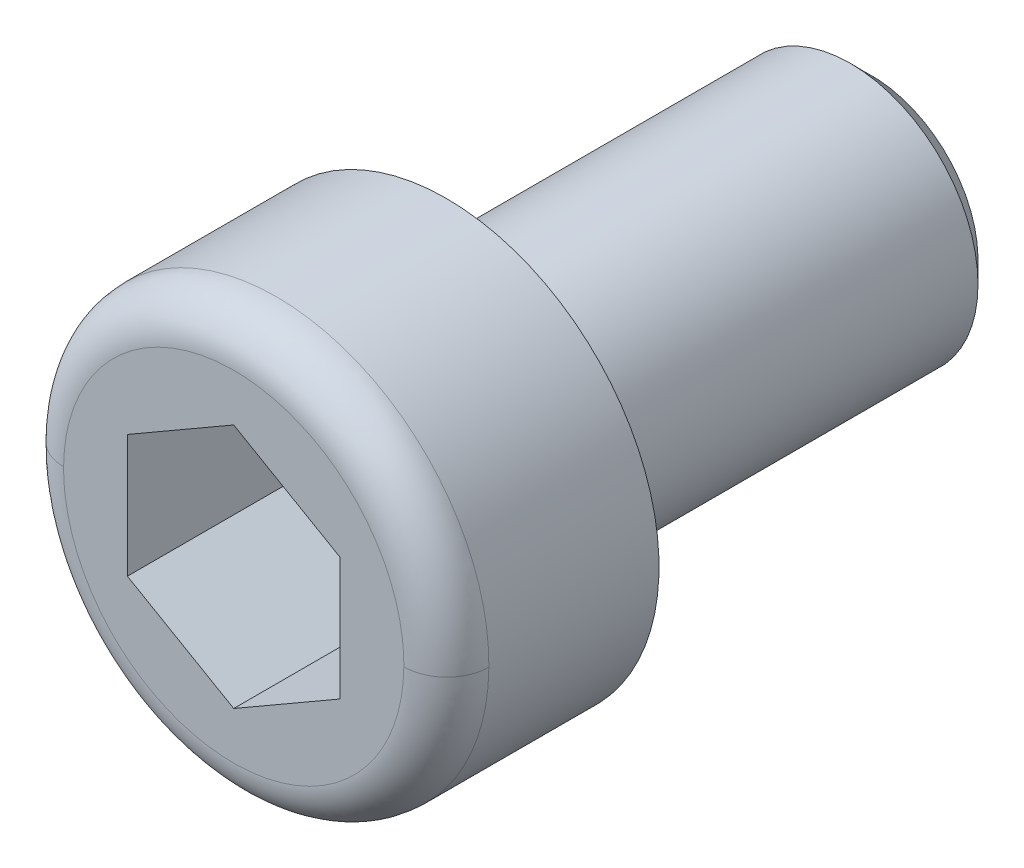
ISO-10303-21;
HEADER;
FILE_DESCRIPTION(('STEP AP214'),'2;1');
FILE_NAME('part.step','',(''),(''),'','','');
FILE_SCHEMA(('AUTOMOTIVE_DESIGN { 1 0 10303 214 1 1 1 1 }'));
ENDSEC;
DATA;
#1=APPLICATION_CONTEXT('core data for automotive mechanical design processes');
#2=APPLICATION_PROTOCOL_DEFINITION('international standard','automotive_design',2000,#1);
#3=PRODUCT_CONTEXT('',#1,'mechanical');
#4=PRODUCT('Part','Part','',(#3));
#5=PRODUCT_RELATED_PRODUCT_CATEGORY('part','',(#4));
#6=PRODUCT_DEFINITION_FORMATION('','',#4);
#7=PRODUCT_DEFINITION_CONTEXT('part definition',#1,'design');
#8=PRODUCT_DEFINITION('design','',#6,#7);
#9=PRODUCT_DEFINITION_SHAPE('','',#8);
#10=(LENGTH_UNIT() NAMED_UNIT(*) SI_UNIT(.MILLI.,.METRE.));
#11=(NAMED_UNIT(*) PLANE_ANGLE_UNIT() SI_UNIT($,.RADIAN.));
#12=(NAMED_UNIT(*) SI_UNIT($,.STERADIAN.) SOLID_ANGLE_UNIT());
#13=UNCERTAINTY_MEASURE_WITH_UNIT(LENGTH_MEASURE(1.E-05),#10,'distance_accuracy_value','');
#14=(GEOMETRIC_REPRESENTATION_CONTEXT(3) GLOBAL_UNCERTAINTY_ASSIGNED_CONTEXT((#13)) GLOBAL_UNIT_ASSIGNED_CONTEXT((#10,
#11,#12)) REPRESENTATION_CONTEXT('',''));
#15=CARTESIAN_POINT('',(0.,0.,0.));
#16=DIRECTION('',(0.,0.,1.));
#17=DIRECTION('',(1.,0.,0.));
#18=AXIS2_PLACEMENT_3D('',#15,#16,#17);
#19=CARTESIAN_POINT('',(-31.176914532,59.4433756774,125.0000000122));
#20=DIRECTION('',(-0.499999996302243,0.86602540591934,0.));
#21=DIRECTION('',(-0.866025405919339,-0.499999996302243,0.));
#22=AXIS2_PLACEMENT_3D('',#19,#20,#21);
#23=PLANE('',#22);
#24=DIRECTION('',(0.,0.,1.));
#25=VECTOR('',#24,1.);
#26=CARTESIAN_POINT('',(-31.176914532,59.4433756774,126.0000000061));
#27=LINE('',#26,#25);
#28=CARTESIAN_POINT('',(-31.1769145348256,59.4433756771983,125.0000000122));
#29=VERTEX_POINT('',#28);
#30=CARTESIAN_POINT('',(-31.176914531494,59.4433756774256,127.));
#31=VERTEX_POINT('',#30);
#32=EDGE_CURVE('E407',#29,#31,#27,.T.);
#33=ORIENTED_EDGE('',*,*,#32,.T.);
#34=DIRECTION('',(0.86602540591934,0.499999996302243,0.));
#35=VECTOR('',#34,1.);
#36=CARTESIAN_POINT('',(-31.8019145393,59.0825317585,127.));
#37=LINE('',#36,#35);
#38=CARTESIAN_POINT('',(-32.4269145396293,58.7216878399177,127.));
#39=VERTEX_POINT('',#38);
#40=EDGE_CURVE('E408',#39,#31,#37,.T.);
#41=ORIENTED_EDGE('',*,*,#40,.F.);
#42=DIRECTION('',(0.,0.,-1.));
#43=VECTOR('',#42,1.);
#44=CARTESIAN_POINT('',(-32.4269145466,58.7216878396,126.0000000061));
#45=LINE('',#44,#43);
#46=CARTESIAN_POINT('',(-32.4269145466,58.7216878396,125.0000000122));
#47=VERTEX_POINT('',#46);
#48=EDGE_CURVE('E415',#39,#47,#45,.T.);
#49=ORIENTED_EDGE('',*,*,#48,.T.);
#50=DIRECTION('',(-0.86602540591934,-0.499999996302243,0.));
#51=VECTOR('',#50,1.);
#52=CARTESIAN_POINT('',(-31.8019145393,59.0825317585,125.0000000122));
#53=LINE('',#52,#51);
#54=EDGE_CURVE('E409',#29,#47,#53,.T.);
#55=ORIENTED_EDGE('',*,*,#54,.F.);
#56=EDGE_LOOP('',(#33,#41,#49,#55));
#57=FACE_BOUND('',#56,.T.);
#58=ADVANCED_FACE('F16',(#57),#23,.F.);
#59=CARTESIAN_POINT('',(-32.4419140594,59.2649995292,119.4999999886));
#60=DIRECTION('',(0.,0.,-1.));
#61=DIRECTION('',(1.,0.,0.));
#62=AXIS2_PLACEMENT_3D('',#59,#60,#61);
#63=PLANE('',#62);
#64=CARTESIAN_POINT('',(-31.176914532,58.0000000018,119.5000001918));
#65=DIRECTION('',(0.,0.,1.));
#66=DIRECTION('',(0.,-1.,0.));
#67=AXIS2_PLACEMENT_3D('',#64,#65,#66);
#68=CIRCLE('',#67,1.24999953199995);
#69=CARTESIAN_POINT('',(-31.176914532,56.7500004698001,119.5000001918));
#70=VERTEX_POINT('',#69);
#71=EDGE_CURVE('E21',#70,#70,#68,.F.);
#72=ORIENTED_EDGE('',*,*,#71,.T.);
#73=EDGE_LOOP('',(#72));
#74=FACE_BOUND('',#73,.T.);
#75=ADVANCED_FACE('F295',(#74),#63,.T.);
#76=CARTESIAN_POINT('',(-29.9269145428,58.7216878396,125.0000000122));
#77=DIRECTION('',(0.500000003922247,0.866025401519928,0.));
#78=DIRECTION('',(-0.866025401519928,0.500000003922247,0.));
#79=AXIS2_PLACEMENT_3D('',#76,#77,#78);
#80=PLANE('',#79);
#81=DIRECTION('',(0.,0.,1.));
#82=VECTOR('',#81,1.);
#83=CARTESIAN_POINT('',(-29.9269145428,58.7216878396,126.0000000061));
#84=LINE('',#83,#82);
#85=CARTESIAN_POINT('',(-29.9269145428,58.7216878396,125.0000000122));
#86=VERTEX_POINT('',#85);
#87=CARTESIAN_POINT('',(-29.9269145399353,58.7216878397589,127.));
#88=VERTEX_POINT('',#87);
#89=EDGE_CURVE('E120',#86,#88,#84,.T.);
#90=ORIENTED_EDGE('',*,*,#89,.T.);
#91=DIRECTION('',(0.866025401519928,-0.500000003922247,0.));
#92=VECTOR('',#91,1.);
#93=CARTESIAN_POINT('',(-30.5519145374,59.0825317585,127.));
#94=LINE('',#93,#92);
#95=EDGE_CURVE('E183',#31,#88,#94,.T.);
#96=ORIENTED_EDGE('',*,*,#95,.F.);
#97=ORIENTED_EDGE('',*,*,#32,.F.);
#98=DIRECTION('',(-0.866025401519928,0.500000003922247,0.));
#99=VECTOR('',#98,1.);
#100=CARTESIAN_POINT('',(-30.5519145374,59.0825317585,125.0000000122));
#101=LINE('',#100,#99);
#102=EDGE_CURVE('E188',#86,#29,#101,.T.);
#103=ORIENTED_EDGE('',*,*,#102,.F.);
#104=EDGE_LOOP('',(#90,#96,#97,#103));
#105=FACE_BOUND('',#104,.T.);
#106=ADVANCED_FACE('F185',(#105),#80,.F.);
#107=CARTESIAN_POINT('',(-32.4269145466,58.7216878396,125.0000000122));
#108=DIRECTION('',(-1.,0.,0.));
#109=DIRECTION('',(0.,-1.,0.));
#110=AXIS2_PLACEMENT_3D('',#107,#108,#109);
#111=PLANE('',#110);
#112=ORIENTED_EDGE('',*,*,#48,.F.);
#113=DIRECTION('',(0.,1.,0.));
#114=VECTOR('',#113,1.);
#115=CARTESIAN_POINT('',(-32.4269145466,58.0000000018,127.));
#116=LINE('',#115,#114);
#117=CARTESIAN_POINT('',(-32.4269145396293,57.2783121636823,127.));
#118=VERTEX_POINT('',#117);
#119=EDGE_CURVE('E83',#118,#39,#116,.T.);
#120=ORIENTED_EDGE('',*,*,#119,.F.);
#121=DIRECTION('',(0.,0.,-1.));
#122=VECTOR('',#121,1.);
#123=CARTESIAN_POINT('',(-32.4269145466,57.278312164,126.0000000061));
#124=LINE('',#123,#122);
#125=CARTESIAN_POINT('',(-32.4269145466,57.278312164,125.0000000122));
#126=VERTEX_POINT('',#125);
#127=EDGE_CURVE('E132',#118,#126,#124,.T.);
#128=ORIENTED_EDGE('',*,*,#127,.T.);
#129=DIRECTION('',(0.,-1.,0.));
#130=VECTOR('',#129,1.);
#131=CARTESIAN_POINT('',(-32.4269145466,58.0000000018,125.0000000122));
#132=LINE('',#131,#130);
#133=EDGE_CURVE('E74',#47,#126,#132,.T.);
#134=ORIENTED_EDGE('',*,*,#133,.F.);
#135=EDGE_LOOP('',(#112,#120,#128,#134));
#136=FACE_BOUND('',#135,.T.);
#137=ADVANCED_FACE('F177',(#136),#111,.F.);
#138=CARTESIAN_POINT('',(-31.176914532,58.0000000018,119.5000001918));
#139=DIRECTION('',(0.,0.,1.));
#140=DIRECTION('',(0.,-1.,0.));
#141=AXIS2_PLACEMENT_3D('',#138,#139,#140);
#142=CONICAL_SURFACE('',#141,1.24999953199999,0.785397858597818);
#143=ORIENTED_EDGE('',*,*,#71,.F.);
#144=EDGE_LOOP('',(#143));
#145=FACE_BOUND('',#144,.T.);
#146=CARTESIAN_POINT('',(-31.176914532,58.0000000018,119.7500005808));
#147=DIRECTION('',(0.,0.,-1.));
#148=DIRECTION('',(0.,1.,0.));
#149=AXIS2_PLACEMENT_3D('',#146,#147,#148);
#150=CIRCLE('',#149,1.49999999719998);
#151=CARTESIAN_POINT('',(-31.176914532,59.499999999,119.7500005808));
#152=VERTEX_POINT('',#151);
#153=EDGE_CURVE('E122',#152,#152,#150,.T.);
#154=ORIENTED_EDGE('',*,*,#153,.T.);
#155=EDGE_LOOP('',(#154));
#156=FACE_BOUND('',#155,.T.);
#157=ADVANCED_FACE('F290',(#145,#156),#142,.T.);
#158=CARTESIAN_POINT('',(-29.9269145428,57.278312164,125.0000000122));
#159=DIRECTION('',(1.,0.,0.));
#160=DIRECTION('',(0.,1.,0.));
#161=AXIS2_PLACEMENT_3D('',#158,#159,#160);
#162=PLANE('',#161);
#163=DIRECTION('',(0.,0.,1.));
#164=VECTOR('',#163,1.);
#165=CARTESIAN_POINT('',(-29.9269145428,57.278312164,126.0000000061));
#166=LINE('',#165,#164);
#167=CARTESIAN_POINT('',(-29.9269145428,57.278312164,125.0000000122));
#168=VERTEX_POINT('',#167);
#169=CARTESIAN_POINT('',(-29.9269145428,57.278312164,127.));
#170=VERTEX_POINT('',#169);
#171=EDGE_CURVE('E102',#168,#170,#166,.T.);
#172=ORIENTED_EDGE('',*,*,#171,.T.);
#173=DIRECTION('',(0.,-1.,0.));
#174=VECTOR('',#173,1.);
#175=CARTESIAN_POINT('',(-29.9269145428,58.0000000018,127.));
#176=LINE('',#175,#174);
#177=EDGE_CURVE('E162',#88,#170,#176,.T.);
#178=ORIENTED_EDGE('',*,*,#177,.F.);
#179=ORIENTED_EDGE('',*,*,#89,.F.);
#180=DIRECTION('',(0.,1.,0.));
#181=VECTOR('',#180,1.);
#182=CARTESIAN_POINT('',(-29.9269145428,58.0000000018,125.0000000122));
#183=LINE('',#182,#181);
#184=EDGE_CURVE('E117',#168,#86,#183,.T.);
#185=ORIENTED_EDGE('',*,*,#184,.F.);
#186=EDGE_LOOP('',(#172,#178,#179,#185));
#187=FACE_BOUND('',#186,.T.);
#188=ADVANCED_FACE('F118',(#187),#162,.F.);
#189=CARTESIAN_POINT('',(-32.4269145466,57.278312164,125.0000000122));
#190=DIRECTION('',(-0.499999996302236,-0.866025405919344,0.));
#191=DIRECTION('',(0.866025405919344,-0.499999996302236,0.));
#192=AXIS2_PLACEMENT_3D('',#189,#190,#191);
#193=PLANE('',#192);
#194=ORIENTED_EDGE('',*,*,#127,.F.);
#195=DIRECTION('',(-0.866025405919344,0.499999996302236,0.));
#196=VECTOR('',#195,1.);
#197=CARTESIAN_POINT('',(-31.8019145393,56.9174682451,127.));
#198=LINE('',#197,#196);
#199=CARTESIAN_POINT('',(-31.176914532,56.5566243262,127.));
#200=VERTEX_POINT('',#199);
#201=EDGE_CURVE('E154',#200,#118,#198,.T.);
#202=ORIENTED_EDGE('',*,*,#201,.F.);
#203=DIRECTION('',(0.,0.,-1.));
#204=VECTOR('',#203,1.);
#205=CARTESIAN_POINT('',(-31.176914532,56.5566243262,126.0000000061));
#206=LINE('',#205,#204);
#207=CARTESIAN_POINT('',(-31.176914535175,56.5566243243669,125.0000000122));
#208=VERTEX_POINT('',#207);
#209=EDGE_CURVE('E112',#200,#208,#206,.T.);
#210=ORIENTED_EDGE('',*,*,#209,.T.);
#211=DIRECTION('',(0.866025403719638,-0.500000000112238,0.));
#212=VECTOR('',#211,1.);
#213=CARTESIAN_POINT('',(-32.4269145466,57.278312164,125.0000000122));
#214=LINE('',#213,#212);
#215=EDGE_CURVE('E95',#126,#208,#214,.T.);
#216=ORIENTED_EDGE('',*,*,#215,.F.);
#217=EDGE_LOOP('',(#194,#202,#210,#216));
#218=FACE_BOUND('',#217,.T.);
#219=ADVANCED_FACE('F180',(#218),#193,.F.);
#220=CARTESIAN_POINT('',(-29.9269145428,59.4433756774,125.0000000122));
#221=DIRECTION('',(0.,0.,1.));
#222=DIRECTION('',(-1.,0.,0.));
#223=AXIS2_PLACEMENT_3D('',#220,#221,#222);
#224=PLANE('',#223);
#225=ORIENTED_EDGE('',*,*,#102,.T.);
#226=ORIENTED_EDGE('',*,*,#54,.T.);
#227=ORIENTED_EDGE('',*,*,#133,.T.);
#228=ORIENTED_EDGE('',*,*,#215,.T.);
#229=DIRECTION('',(0.866025401519932,0.50000000392224,0.));
#230=VECTOR('',#229,1.);
#231=CARTESIAN_POINT('',(-30.5519145374,56.9174682451,125.0000000122));
#232=LINE('',#231,#230);
#233=EDGE_CURVE('E106',#208,#168,#232,.T.);
#234=ORIENTED_EDGE('',*,*,#233,.T.);
#235=ORIENTED_EDGE('',*,*,#184,.T.);
#236=EDGE_LOOP('',(#225,#226,#227,#228,#234,#235));
#237=FACE_BOUND('',#236,.T.);
#238=ADVANCED_FACE('F124',(#237),#224,.T.);
#239=CARTESIAN_POINT('',(-31.176914532,58.0000000018,124.4999999962));
#240=DIRECTION('',(0.,0.,-1.));
#241=DIRECTION('',(-1.,0.,0.));
#242=AXIS2_PLACEMENT_3D('',#239,#240,#241);
#243=CYLINDRICAL_SURFACE('',#242,1.49999999719998);
#244=ORIENTED_EDGE('',*,*,#153,.F.);
#245=EDGE_LOOP('',(#244));
#246=FACE_BOUND('',#245,.T.);
#247=CARTESIAN_POINT('',(-31.176914532,58.0000000018,124.4999999962));
#248=DIRECTION('',(0.,0.,-1.));
#249=DIRECTION('',(-1.,0.,0.));
#250=AXIS2_PLACEMENT_3D('',#247,#248,#249);
#251=CIRCLE('',#250,1.49999999719998);
#252=CARTESIAN_POINT('',(-32.6769145292,58.0000000018,124.4999999962));
#253=VERTEX_POINT('',#252);
#254=EDGE_CURVE('E125',#253,#253,#251,.F.);
#255=ORIENTED_EDGE('',*,*,#254,.F.);
#256=EDGE_LOOP('',(#255));
#257=FACE_BOUND('',#256,.T.);
#258=ADVANCED_FACE('F214',(#246,#257),#243,.T.);
#259=CARTESIAN_POINT('',(-33.1697566115801,58.0179514842323,127.));
#260=CARTESIAN_POINT('',(-33.1592408890172,59.1853313187468,127.));
#261=CARTESIAN_POINT('',(-32.3263429107098,60.0033578039431,127.));
#262=CARTESIAN_POINT('',(-31.1589630495677,59.9928420813801,127.));
#263=CARTESIAN_POINT('',(-29.9915832150532,59.9823263328034,127.));
#264=CARTESIAN_POINT('',(-29.1735567298569,59.1494283805098,127.));
#265=CARTESIAN_POINT('',(-29.1840724784336,57.9820485199815,127.));
#266=CARTESIAN_POINT('',(-33.1721155384534,58.0179727332215,127.));
#267=CARTESIAN_POINT('',(-33.1615873684115,59.1867343954312,127.));
#268=CARTESIAN_POINT('',(-32.3277034890065,60.0057291782954,127.));
#269=CARTESIAN_POINT('',(-31.1589418005785,59.9952010082534,127.));
#270=CARTESIAN_POINT('',(-29.9901801383688,59.9846728124023,127.));
#271=CARTESIAN_POINT('',(-29.1711853555046,59.1507889588065,127.));
#272=CARTESIAN_POINT('',(-29.1817135513557,57.9820272707877,127.));
#273=CARTESIAN_POINT('',(-33.1744744653267,58.0179939822108,127.));
#274=CARTESIAN_POINT('',(-33.1639338478057,59.1881374721156,127.));
#275=CARTESIAN_POINT('',(-32.3290640673033,60.0081005526477,127.));
#276=CARTESIAN_POINT('',(-31.1589205515892,59.9975599351267,127.));
#277=CARTESIAN_POINT('',(-29.9887770616844,59.9870192920012,127.));
#278=CARTESIAN_POINT('',(-29.1688139811523,59.1521495371033,127.));
#279=CARTESIAN_POINT('',(-29.1793546242779,57.9820060215938,127.));
#280=CARTESIAN_POINT('',(-33.1768333922,58.0180152312,127.));
#281=CARTESIAN_POINT('',(-33.1662803272,59.1895405488,127.));
#282=CARTESIAN_POINT('',(-32.3304246456,60.010471927,127.));
#283=CARTESIAN_POINT('',(-31.1588993026,59.999918862,127.));
#284=CARTESIAN_POINT('',(-29.987373985,59.9893657716,127.));
#285=CARTESIAN_POINT('',(-29.1664426068,59.1535101154,127.));
#286=CARTESIAN_POINT('',(-29.1769956972,57.9819847724,127.));
#287=CARTESIAN_POINT('',(-33.4697147216,58.0206534784,127.));
#288=CARTESIAN_POINT('',(-33.4576161936,59.363744747,127.));
#289=CARTESIAN_POINT('',(-32.4993522986,60.3048987194,127.));
#290=CARTESIAN_POINT('',(-31.1562610554,60.2928001914,127.));
#291=CARTESIAN_POINT('',(-29.8131697868,60.2807016634,127.));
#292=CARTESIAN_POINT('',(-28.8720158144,59.3224377684,127.));
#293=CARTESIAN_POINT('',(-28.8841143424,57.9793464998,127.));
#294=CARTESIAN_POINT('',(-33.6768131136,58.0225190322,126.792893226));
#295=CARTESIAN_POINT('',(-33.663621776,59.4869257046,126.792893226));
#296=CARTESIAN_POINT('',(-32.6188021994,60.513089921,126.792893226));
#297=CARTESIAN_POINT('',(-31.1543955016,60.4998985834,126.792893226));
#298=CARTESIAN_POINT('',(-29.6899888292,60.4867072458,126.792893226));
#299=CARTESIAN_POINT('',(-28.6638246128,59.4418876438,126.792893226));
#300=CARTESIAN_POINT('',(-28.6770159504,57.9774809714,126.792893226));
#301=CARTESIAN_POINT('',(-33.6768131136,58.0225190322,126.5000000094));
#302=CARTESIAN_POINT('',(-33.663621776,59.4869257046,126.5000000094));
#303=CARTESIAN_POINT('',(-32.6188021994,60.513089921,126.5000000094));
#304=CARTESIAN_POINT('',(-31.1543955016,60.4998985834,126.5000000094));
#305=CARTESIAN_POINT('',(-29.6899888292,60.4867072458,126.5000000094));
#306=CARTESIAN_POINT('',(-28.6638246128,59.4418876438,126.5000000094));
#307=CARTESIAN_POINT('',(-28.6770159504,57.9774809714,126.5000000094));
#308=CARTESIAN_POINT('',(-33.6768131136,58.0225190322,126.4998000094));
#309=CARTESIAN_POINT('',(-33.663621776,59.4869257046,126.4998000094));
#310=CARTESIAN_POINT('',(-32.6188021994,60.513089921,126.4998000094));
#311=CARTESIAN_POINT('',(-31.1543955016,60.4998985834,126.4998000094));
#312=CARTESIAN_POINT('',(-29.6899888292,60.4867072458,126.4998000094));
#313=CARTESIAN_POINT('',(-28.6638246128,59.4418876438,126.4998000094));
#314=CARTESIAN_POINT('',(-28.6770159504,57.9774809714,126.4998000094));
#315=CARTESIAN_POINT('',(-33.6768131136,58.0225190322,126.4996000094));
#316=CARTESIAN_POINT('',(-33.663621776,59.4869257046,126.4996000094));
#317=CARTESIAN_POINT('',(-32.6188021994,60.513089921,126.4996000094));
#318=CARTESIAN_POINT('',(-31.1543955016,60.4998985834,126.4996000094));
#319=CARTESIAN_POINT('',(-29.6899888292,60.4867072458,126.4996000094));
#320=CARTESIAN_POINT('',(-28.6638246128,59.4418876438,126.4996000094));
#321=CARTESIAN_POINT('',(-28.6770159504,57.9774809714,126.4996000094));
#322=CARTESIAN_POINT('',(-33.6768131136,58.0225190322,126.4994000094));
#323=CARTESIAN_POINT('',(-33.663621776,59.4869257046,126.4994000094));
#324=CARTESIAN_POINT('',(-32.6188021994,60.513089921,126.4994000094));
#325=CARTESIAN_POINT('',(-31.1543955016,60.4998985834,126.4994000094));
#326=CARTESIAN_POINT('',(-29.6899888292,60.4867072458,126.4994000094));
#327=CARTESIAN_POINT('',(-28.6638246128,59.4418876438,126.4994000094));
#328=CARTESIAN_POINT('',(-28.6770159504,57.9774809714,126.4994000094));
#329=(BOUNDED_SURFACE() B_SPLINE_SURFACE(3,3,((#259,#260,#261,#262,#263,#264,#265),(#266,#267,
#268,#269,#270,#271,#272),(#273,#274,#275,#276,#277,#278,#279),(#280,#281,#282,#283,#284,#285,
#286),(#287,#288,#289,#290,#291,#292,#293),(#294,#295,#296,#297,#298,#299,#300),(#301,#302,#303,
#304,#305,#306,#307),(#308,#309,#310,#311,#312,#313,#314),(#315,#316,#317,#318,#319,#320,#321),
(#322,#323,#324,#325,#326,#327,#328)),.UNSPECIFIED.,.F.,.F.,.F.) B_SPLINE_SURFACE_WITH_KNOTS((4,
3,3,4),(4,3,4),(0.0118245362824855,0.0214045679639189,0.978595532615453,0.979407736107261),(0.,
0.5,1.),
.UNSPECIFIED.) GEOMETRIC_REPRESENTATION_ITEM() RATIONAL_B_SPLINE_SURFACE(((0.986784784485378,
0.794103069890038,0.794103069890038,0.986784784485378,0.794103069890038,0.794103069890038,
0.986784784485378),(0.986784784485378,0.794103069890038,0.794103069890038,0.986784784485378,
0.794103069890038,0.794103069890038,0.986784784485378),(0.986784784485378,0.794103069890038,
0.794103069890038,0.986784784485378,0.794103069890038,0.794103069890038,0.986784784485378),
(0.986784784485378,0.794103069890038,0.794103069890038,0.986784784485378,0.794103069890038,
0.794103069890038,0.986784784485378),(0.794103079736294,0.639044808292815,0.639044808292815,
0.794103079736294,0.639044808292815,0.639044808292815,0.794103079736294),(0.794103099982836,
0.639044824585973,0.639044824585973,0.794103099982836,0.639044824585973,0.639044824585973,
0.794103099982836),(0.986784845225003,0.794103118769514,0.794103118769514,0.986784845225003,
0.794103118769514,0.794103118769514,0.986784845225003),(0.986784845225003,0.794103118769514,
0.794103118769514,0.986784845225003,0.794103118769514,0.794103118769514,0.986784845225003),
(0.986784845225003,0.794103118769514,0.794103118769514,0.986784845225003,0.794103118769514,
0.794103118769514,0.986784845225003),(0.986784845225003,0.794103118769514,0.794103118769514,
0.986784845225003,0.794103118769514,0.794103118769514,0.986784845225003))) REPRESENTATION_ITEM('') SURFACE());
#330=CARTESIAN_POINT('',(-33.1768333922266,58.0180152312003,127.));
#331=CARTESIAN_POINT('',(-33.1662803272265,59.1895405488159,127.));
#332=CARTESIAN_POINT('',(-32.3304246456154,60.0104719270268,127.));
#333=CARTESIAN_POINT('',(-31.1588993025998,59.9999188620267,127.));
#334=CARTESIAN_POINT('',(-29.9873739849842,59.9893657716265,127.));
#335=CARTESIAN_POINT('',(-29.1664426067732,59.1535101154154,127.));
#336=CARTESIAN_POINT('',(-29.1769956971733,57.9819847723998,127.));
#337=(BOUNDED_CURVE() B_SPLINE_CURVE(3,(#330,#331,#332,#333,#334,#335,#336),.UNSPECIFIED.,.F.,
.F.) B_SPLINE_CURVE_WITH_KNOTS((4,3,4),(0.,0.5,1.),
.UNSPECIFIED.) CURVE() GEOMETRIC_REPRESENTATION_ITEM() RATIONAL_B_SPLINE_CURVE((0.986784784463592,
0.794103069872506,0.794103069872506,0.986784784463592,0.794103069872506,0.794103069872506,0.986784784463592)) REPRESENTATION_ITEM(''));
#338=CARTESIAN_POINT('',(-33.1768344107857,58.0180152373547,127.));
#339=VERTEX_POINT('',#338);
#340=CARTESIAN_POINT('',(-29.1769145502479,57.999999998903,127.));
#341=VERTEX_POINT('',#340);
#342=EDGE_CURVE('E149',#339,#341,#337,.T.);
#343=DIRECTION('',(0.00450386574027812,0.999989857545262,0.));
#344=VECTOR('',#343,1.);
#345=CARTESIAN_POINT('',(-29.1769956972,57.9819847724,127.));
#346=LINE('',#345,#344);
#347=CARTESIAN_POINT('',(-29.1769946701476,57.9819847662454,127.));
#348=VERTEX_POINT('',#347);
#349=EDGE_CURVE('E172',#341,#348,#346,.F.);
#350=CARTESIAN_POINT('',(-28.6770159504,57.9774809714,126.492928941809));
#351=CARTESIAN_POINT('',(-28.6770159504,57.9774809714,126.49528596434));
#352=CARTESIAN_POINT('',(-28.6770159504,57.9774809714,126.49764298687));
#353=CARTESIAN_POINT('',(-28.6770159504,57.9774809714,126.5000000094));
#354=CARTESIAN_POINT('',(-28.6770159504,57.9774809714,126.792893226));
#355=CARTESIAN_POINT('',(-28.8841143424,57.9793464998,127.));
#356=CARTESIAN_POINT('',(-29.1769956972,57.9819847724,127.));
#357=CARTESIAN_POINT('',(-29.1793761936304,57.9820062158904,127.));
#358=CARTESIAN_POINT('',(-29.1817566900608,57.9820276593807,127.));
#359=CARTESIAN_POINT('',(-29.1841371864912,57.9820491028711,127.));
#360=(BOUNDED_CURVE() B_SPLINE_CURVE(3,(#350,#351,#352,#353,#354,#355,#356,#357,#358,#359),
.UNSPECIFIED.,.F.,.F.) B_SPLINE_CURVE_WITH_KNOTS((4,3,3,4),(0.0117369392209384,
0.0213088488674538,0.978499813518988,0.988167442261968),
.UNSPECIFIED.) CURVE() GEOMETRIC_REPRESENTATION_ITEM() RATIONAL_B_SPLINE_CURVE((0.986784845225003,
0.986784845225003,0.986784845225003,0.986784845225003,0.794103099982836,0.794103079736294,
0.986784784485378,0.986784784485378,0.986784784485378,0.986784784485378)) REPRESENTATION_ITEM(''));
#361=CARTESIAN_POINT('',(-28.6770159507894,57.9774809726909,126.500000009211));
#362=VERTEX_POINT('',#361);
#363=EDGE_CURVE('E36',#362,#348,#360,.T.);
#364=CARTESIAN_POINT('',(-31.176914532,58.0000000018,126.5000000094));
#365=DIRECTION('',(0.,0.,-1.));
#366=DIRECTION('',(-1.,0.,0.));
#367=AXIS2_PLACEMENT_3D('',#364,#365,#366);
#368=CIRCLE('',#367,2.5000000038);
#369=CARTESIAN_POINT('',(-33.6768131130056,58.0225190313988,126.500000009258));
#370=VERTEX_POINT('',#369);
#371=EDGE_CURVE('E128',#362,#370,#368,.F.);
#372=CARTESIAN_POINT('',(-33.1696919035282,58.0179509013483,127.));
#373=CARTESIAN_POINT('',(-33.1720723997521,58.0179723446322,127.));
#374=CARTESIAN_POINT('',(-33.1744528959761,58.0179937879161,127.));
#375=CARTESIAN_POINT('',(-33.1768333922,58.0180152312,127.));
#376=CARTESIAN_POINT('',(-33.4697147216,58.0206534784,127.));
#377=CARTESIAN_POINT('',(-33.6768131136,58.0225190322,126.792893226));
#378=CARTESIAN_POINT('',(-33.6768131136,58.0225190322,126.5000000094));
#379=CARTESIAN_POINT('',(-33.6768131136,58.0225190322,126.49764298687));
#380=CARTESIAN_POINT('',(-33.6768131136,58.0225190322,126.49528596434));
#381=CARTESIAN_POINT('',(-33.6768131136,58.0225190322,126.492928941809));
#382=(BOUNDED_CURVE() B_SPLINE_CURVE(3,(#372,#373,#374,#375,#376,#377,#378,#379,#380,#381),
.UNSPECIFIED.,.F.,.F.) B_SPLINE_CURVE_WITH_KNOTS((4,3,3,4),(0.0117369392209384,
0.0214045679639189,0.978595532615453,0.988167442261968),
.UNSPECIFIED.) CURVE() GEOMETRIC_REPRESENTATION_ITEM() RATIONAL_B_SPLINE_CURVE((0.986784784485378,
0.986784784485378,0.986784784485378,0.986784784485378,0.794103079736294,0.794103099982836,
0.986784845225003,0.986784845225003,0.986784845225003,0.986784845225003)) REPRESENTATION_ITEM(''));
#383=EDGE_CURVE('E113',#339,#370,#382,.T.);
#384=ORIENTED_EDGE('',*,*,#342,.T.);
#385=ORIENTED_EDGE('',*,*,#349,.T.);
#386=ORIENTED_EDGE('',*,*,#363,.F.);
#387=ORIENTED_EDGE('',*,*,#371,.T.);
#388=ORIENTED_EDGE('',*,*,#383,.F.);
#389=EDGE_LOOP('',(#384,#385,#386,#387,#388));
#390=FACE_BOUND('',#389,.T.);
#391=ADVANCED_FACE('F202',(#390),#329,.F.);
#392=CARTESIAN_POINT('',(-31.176914532,56.5566243262,125.0000000122));
#393=DIRECTION('',(0.50000000392224,-0.866025401519932,0.));
#394=DIRECTION('',(0.866025401519933,0.50000000392224,0.));
#395=AXIS2_PLACEMENT_3D('',#392,#393,#394);
#396=PLANE('',#395);
#397=ORIENTED_EDGE('',*,*,#209,.F.);
#398=DIRECTION('',(0.866025401519933,0.50000000392224,0.));
#399=VECTOR('',#398,1.);
#400=CARTESIAN_POINT('',(-31.176914532,56.5566243262,127.));
#401=LINE('',#400,#399);
#402=EDGE_CURVE('E109',#200,#170,#401,.T.);
#403=ORIENTED_EDGE('',*,*,#402,.T.);
#404=ORIENTED_EDGE('',*,*,#171,.F.);
#405=ORIENTED_EDGE('',*,*,#233,.F.);
#406=EDGE_LOOP('',(#397,#403,#404,#405));
#407=FACE_BOUND('',#406,.T.);
#408=ADVANCED_FACE('F105',(#407),#396,.F.);
#409=CARTESIAN_POINT('',(-33.7069145266,60.5299999964,124.4999999962));
#410=DIRECTION('',(0.,0.,-1.));
#411=DIRECTION('',(1.,0.,0.));
#412=AXIS2_PLACEMENT_3D('',#409,#410,#411);
#413=PLANE('',#412);
#414=ORIENTED_EDGE('',*,*,#254,.T.);
#415=EDGE_LOOP('',(#414));
#416=FACE_BOUND('',#415,.T.);
#417=CARTESIAN_POINT('',(-31.176914532,58.0000000018,124.4999999962));
#418=DIRECTION('',(0.,0.,-1.));
#419=DIRECTION('',(0.,1.,0.));
#420=AXIS2_PLACEMENT_3D('',#417,#418,#419);
#421=CIRCLE('',#420,2.5000000038);
#422=CARTESIAN_POINT('',(-31.176914532,60.5000000056,124.4999999962));
#423=VERTEX_POINT('',#422);
#424=EDGE_CURVE('E166',#423,#423,#421,.T.);
#425=ORIENTED_EDGE('',*,*,#424,.T.);
#426=EDGE_LOOP('',(#425));
#427=FACE_BOUND('',#426,.T.);
#428=ADVANCED_FACE('F271',(#416,#427),#413,.T.);
#429=CARTESIAN_POINT('',(-33.2009145226,60.0241105586,127.));
#430=DIRECTION('',(0.,0.,-1.));
#431=DIRECTION('',(1.,0.,0.));
#432=AXIS2_PLACEMENT_3D('',#429,#430,#431);
#433=PLANE('',#432);
#434=ORIENTED_EDGE('',*,*,#201,.T.);
#435=ORIENTED_EDGE('',*,*,#119,.T.);
#436=ORIENTED_EDGE('',*,*,#40,.T.);
#437=ORIENTED_EDGE('',*,*,#95,.T.);
#438=ORIENTED_EDGE('',*,*,#177,.T.);
#439=ORIENTED_EDGE('',*,*,#402,.F.);
#440=EDGE_LOOP('',(#434,#435,#436,#437,#438,#439));
#441=FACE_BOUND('',#440,.T.);
#442=DIRECTION('',(-0.00450384429455409,-0.999989857641851,0.));
#443=VECTOR('',#442,1.);
#444=CARTESIAN_POINT('',(-33.1768333922,58.0180152312,127.));
#445=LINE('',#444,#443);
#446=CARTESIAN_POINT('',(-33.1769145262589,58.000000004697,127.));
#447=VERTEX_POINT('',#446);
#448=EDGE_CURVE('E170',#447,#339,#445,.F.);
#449=ORIENTED_EDGE('',*,*,#448,.F.);
#450=CARTESIAN_POINT('',(-29.1769956971733,57.9819847723998,127.));
#451=CARTESIAN_POINT('',(-29.1875487621735,56.8104594293841,127.));
#452=CARTESIAN_POINT('',(-30.0234044183846,55.9895280765732,127.));
#453=CARTESIAN_POINT('',(-31.1949297614002,56.0000811415734,127.));
#454=CARTESIAN_POINT('',(-32.3664551044159,56.0106342319735,127.));
#455=CARTESIAN_POINT('',(-33.1873864572268,56.8464898881846,127.));
#456=CARTESIAN_POINT('',(-33.1768333922266,58.0180152312003,127.));
#457=(BOUNDED_CURVE() B_SPLINE_CURVE(3,(#450,#451,#452,#453,#454,#455,#456),.UNSPECIFIED.,.F.,
.F.) B_SPLINE_CURVE_WITH_KNOTS((4,3,4),(0.,0.5,1.),
.UNSPECIFIED.) CURVE() GEOMETRIC_REPRESENTATION_ITEM() RATIONAL_B_SPLINE_CURVE((0.986784784463592,
0.794103069872505,0.794103069872505,0.986784784463592,0.794103069872505,0.794103069872505,0.986784784463592)) REPRESENTATION_ITEM(''));
#458=EDGE_CURVE('E27',#447,#348,#457,.F.);
#459=ORIENTED_EDGE('',*,*,#458,.T.);
#460=ORIENTED_EDGE('',*,*,#349,.F.);
#461=ORIENTED_EDGE('',*,*,#342,.F.);
#462=EDGE_LOOP('',(#449,#459,#460,#461));
#463=FACE_BOUND('',#462,.T.);
#464=ADVANCED_FACE('F18',(#441,#463),#433,.F.);
#465=CARTESIAN_POINT('',(-31.176914532,58.0000000018,126.5000000094));
#466=DIRECTION('',(0.,0.,-1.));
#467=DIRECTION('',(0.,1.,0.));
#468=AXIS2_PLACEMENT_3D('',#465,#466,#467);
#469=CYLINDRICAL_SURFACE('',#468,2.5000000038);
#470=CARTESIAN_POINT('',(-31.176914532,58.0000000018,126.5000000094));
#471=DIRECTION('',(0.,0.,-1.));
#472=DIRECTION('',(0.,1.,0.));
#473=AXIS2_PLACEMENT_3D('',#470,#471,#472);
#474=CIRCLE('',#473,2.5000000038);
#475=EDGE_CURVE('E11',#362,#370,#474,.T.);
#476=ORIENTED_EDGE('',*,*,#475,.T.);
#477=ORIENTED_EDGE('',*,*,#371,.F.);
#478=EDGE_LOOP('',(#476,#477));
#479=FACE_BOUND('',#478,.T.);
#480=ORIENTED_EDGE('',*,*,#424,.F.);
#481=EDGE_LOOP('',(#480));
#482=FACE_BOUND('',#481,.T.);
#483=ADVANCED_FACE('F215',(#479,#482),#469,.T.);
#484=CARTESIAN_POINT('',(-29.1841371864912,57.9820491028711,127.));
#485=CARTESIAN_POINT('',(-29.1946525676056,56.814707146826,127.));
#486=CARTESIAN_POINT('',(-30.0275234755032,55.9967072497767,127.));
#487=CARTESIAN_POINT('',(-31.1948654309289,56.0072226302718,127.));
#488=CARTESIAN_POINT('',(-32.362207386974,56.0177380374056,127.));
#489=CARTESIAN_POINT('',(-33.1802072840233,56.8506089453032,127.));
#490=CARTESIAN_POINT('',(-33.1696919035282,58.0179509013483,127.));
#491=CARTESIAN_POINT('',(-29.1817566900608,57.9820276593807,127.));
#492=CARTESIAN_POINT('',(-29.1922846324704,56.8132912410173,127.));
#493=CARTESIAN_POINT('',(-30.0261504564688,55.9943141920512,127.));
#494=CARTESIAN_POINT('',(-31.1948868744193,56.0048421340479,127.));
#495=CARTESIAN_POINT('',(-32.3636232927827,56.0153701022704,127.));
#496=CARTESIAN_POINT('',(-33.1826003417488,56.8492359262688,127.));
#497=CARTESIAN_POINT('',(-33.1720723997521,58.0179723446322,127.));
#498=CARTESIAN_POINT('',(-29.1793761936304,57.9820062158904,127.));
#499=CARTESIAN_POINT('',(-29.1899166973352,56.8118753352086,127.));
#500=CARTESIAN_POINT('',(-30.0247774374344,55.9919211343256,127.));
#501=CARTESIAN_POINT('',(-31.1949083179097,56.0024616378239,127.));
#502=CARTESIAN_POINT('',(-32.3650391985913,56.0130021671352,127.));
#503=CARTESIAN_POINT('',(-33.1849933994744,56.8478629072344,127.));
#504=CARTESIAN_POINT('',(-33.1744528959761,58.0179937879161,127.));
#505=CARTESIAN_POINT('',(-29.1769956972,57.9819847724,127.));
#506=CARTESIAN_POINT('',(-29.1875487622,56.8104594294,127.));
#507=CARTESIAN_POINT('',(-30.0234044184,55.9895280766,127.));
#508=CARTESIAN_POINT('',(-31.1949297614,56.0000811416,127.));
#509=CARTESIAN_POINT('',(-32.3664551044,56.010634232,127.));
#510=CARTESIAN_POINT('',(-33.1873864572,56.8464898882,127.));
#511=CARTESIAN_POINT('',(-33.1768333922,58.0180152312,127.));
#512=CARTESIAN_POINT('',(-28.8841143424,57.9793464998,127.));
#513=CARTESIAN_POINT('',(-28.8962128704,56.6362552566,127.));
#514=CARTESIAN_POINT('',(-29.8544767654,55.6951012588,127.));
#515=CARTESIAN_POINT('',(-31.197568034,55.7071998122,127.));
#516=CARTESIAN_POINT('',(-32.5406592772,55.7192983402,127.));
#517=CARTESIAN_POINT('',(-33.481813275,56.6775622352,127.));
#518=CARTESIAN_POINT('',(-33.4697147216,58.0206534784,127.));
#519=CARTESIAN_POINT('',(-28.6770159504,57.9774809714,126.792893226));
#520=CARTESIAN_POINT('',(-28.690207288,56.513074299,126.792893226));
#521=CARTESIAN_POINT('',(-29.73502689,55.4869100826,126.792893226));
#522=CARTESIAN_POINT('',(-31.1994335624,55.5001014202,126.792893226));
#523=CARTESIAN_POINT('',(-32.6638402348,55.5132927578,126.792893226));
#524=CARTESIAN_POINT('',(-33.6900044512,56.5581123344,126.792893226));
#525=CARTESIAN_POINT('',(-33.6768131136,58.0225190322,126.792893226));
#526=CARTESIAN_POINT('',(-28.6770159504,57.9774809714,126.5000000094));
#527=CARTESIAN_POINT('',(-28.690207288,56.513074299,126.5000000094));
#528=CARTESIAN_POINT('',(-29.73502689,55.4869100826,126.5000000094));
#529=CARTESIAN_POINT('',(-31.1994335624,55.5001014202,126.5000000094));
#530=CARTESIAN_POINT('',(-32.6638402348,55.5132927578,126.5000000094));
#531=CARTESIAN_POINT('',(-33.6900044512,56.5581123344,126.5000000094));
#532=CARTESIAN_POINT('',(-33.6768131136,58.0225190322,126.5000000094));
#533=CARTESIAN_POINT('',(-28.6770159504,57.9774809714,126.49764298687));
#534=CARTESIAN_POINT('',(-28.690207288,56.513074299,126.49764298687));
#535=CARTESIAN_POINT('',(-29.73502689,55.4869100826,126.49764298687));
#536=CARTESIAN_POINT('',(-31.1994335624,55.5001014202,126.49764298687));
#537=CARTESIAN_POINT('',(-32.6638402348,55.5132927578,126.49764298687));
#538=CARTESIAN_POINT('',(-33.6900044512,56.5581123344,126.49764298687));
#539=CARTESIAN_POINT('',(-33.6768131136,58.0225190322,126.49764298687));
#540=CARTESIAN_POINT('',(-28.6770159504,57.9774809714,126.49528596434));
#541=CARTESIAN_POINT('',(-28.690207288,56.513074299,126.49528596434));
#542=CARTESIAN_POINT('',(-29.73502689,55.4869100826,126.49528596434));
#543=CARTESIAN_POINT('',(-31.1994335624,55.5001014202,126.49528596434));
#544=CARTESIAN_POINT('',(-32.6638402348,55.5132927578,126.49528596434));
#545=CARTESIAN_POINT('',(-33.6900044512,56.5581123344,126.49528596434));
#546=CARTESIAN_POINT('',(-33.6768131136,58.0225190322,126.49528596434));
#547=CARTESIAN_POINT('',(-28.6770159504,57.9774809714,126.492928941809));
#548=CARTESIAN_POINT('',(-28.690207288,56.513074299,126.492928941809));
#549=CARTESIAN_POINT('',(-29.73502689,55.4869100826,126.492928941809));
#550=CARTESIAN_POINT('',(-31.1994335624,55.5001014202,126.492928941809));
#551=CARTESIAN_POINT('',(-32.6638402348,55.5132927578,126.492928941809));
#552=CARTESIAN_POINT('',(-33.6900044512,56.5581123344,126.492928941809));
#553=CARTESIAN_POINT('',(-33.6768131136,58.0225190322,126.492928941809));
#554=(BOUNDED_SURFACE() B_SPLINE_SURFACE(3,3,((#484,#485,#486,#487,#488,#489,#490),(#491,#492,
#493,#494,#495,#496,#497),(#498,#499,#500,#501,#502,#503,#504),(#505,#506,#507,#508,#509,#510,
#511),(#512,#513,#514,#515,#516,#517,#518),(#519,#520,#521,#522,#523,#524,#525),(#526,#527,#528,
#529,#530,#531,#532),(#533,#534,#535,#536,#537,#538,#539),(#540,#541,#542,#543,#544,#545,#546),
(#547,#548,#549,#550,#551,#552,#553)),.UNSPECIFIED.,.F.,.F.,.F.) B_SPLINE_SURFACE_WITH_KNOTS((4,
3,3,4),(4,3,4),(0.0117369392209384,0.0214045679639189,0.978595532615453,0.988167442261968),(0.,
0.5,1.),
.UNSPECIFIED.) GEOMETRIC_REPRESENTATION_ITEM() RATIONAL_B_SPLINE_SURFACE(((0.986784784485378,
0.794103069890037,0.794103069890037,0.986784784485378,0.794103069890037,0.794103069890037,
0.986784784485378),(0.986784784485378,0.794103069890037,0.794103069890037,0.986784784485378,
0.794103069890037,0.794103069890037,0.986784784485378),(0.986784784485378,0.794103069890037,
0.794103069890037,0.986784784485378,0.794103069890037,0.794103069890037,0.986784784485378),
(0.986784784485378,0.794103069890037,0.794103069890037,0.986784784485378,0.794103069890037,
0.794103069890037,0.986784784485378),(0.794103079736294,0.639044808292814,0.639044808292814,
0.794103079736294,0.639044808292814,0.639044808292814,0.794103079736294),(0.794103099982836,
0.639044824585973,0.639044824585973,0.794103099982836,0.639044824585973,0.639044824585973,
0.794103099982836),(0.986784845225003,0.794103118769513,0.794103118769513,0.986784845225003,
0.794103118769513,0.794103118769513,0.986784845225003),(0.986784845225003,0.794103118769513,
0.794103118769513,0.986784845225003,0.794103118769513,0.794103118769513,0.986784845225003),
(0.986784845225003,0.794103118769513,0.794103118769513,0.986784845225003,0.794103118769513,
0.794103118769513,0.986784845225003),(0.986784845225003,0.794103118769513,0.794103118769513,
0.986784845225003,0.794103118769513,0.794103118769513,0.986784845225003))) REPRESENTATION_ITEM('') SURFACE());
#555=ORIENTED_EDGE('',*,*,#383,.T.);
#556=ORIENTED_EDGE('',*,*,#475,.F.);
#557=ORIENTED_EDGE('',*,*,#363,.T.);
#558=ORIENTED_EDGE('',*,*,#458,.F.);
#559=ORIENTED_EDGE('',*,*,#448,.T.);
#560=EDGE_LOOP('',(#555,#556,#557,#558,#559));
#561=FACE_BOUND('',#560,.T.);
#562=ADVANCED_FACE('F244',(#561),#554,.F.);
#563=CLOSED_SHELL('',(#58,#75,#106,#137,#157,#188,#219,#238,#258,#391,#408,#428,#464,#483,#562));
#564=MANIFOLD_SOLID_BREP('B1',#563);
#565=ADVANCED_BREP_SHAPE_REPRESENTATION('',(#18,#564),#14);
#566=SHAPE_DEFINITION_REPRESENTATION(#9,#565);
ENDSEC;
END-ISO-10303-21;
